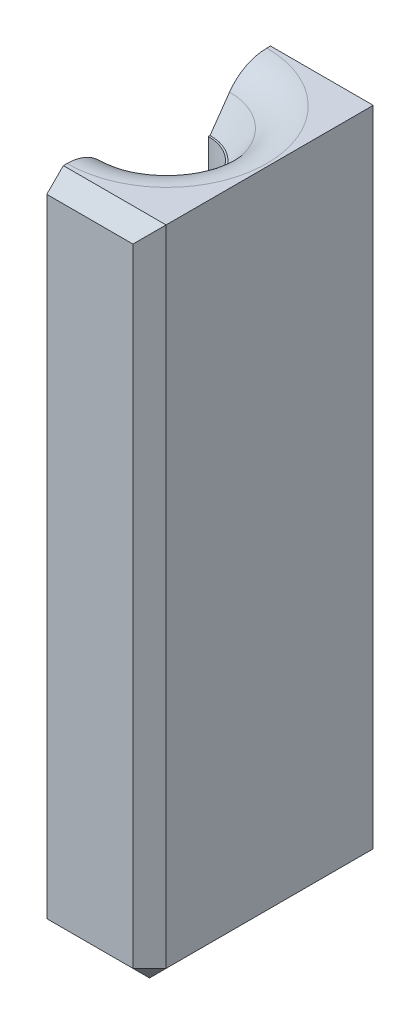
ISO-10303-21;
HEADER;
FILE_DESCRIPTION(('STEP AP214'),'2;1');
FILE_NAME('part.step','',(''),(''),'','','');
FILE_SCHEMA(('AUTOMOTIVE_DESIGN { 1 0 10303 214 1 1 1 1 }'));
ENDSEC;
DATA;
#1=APPLICATION_CONTEXT('core data for automotive mechanical design processes');
#2=APPLICATION_PROTOCOL_DEFINITION('international standard','automotive_design',2000,#1);
#3=PRODUCT_CONTEXT('',#1,'mechanical');
#4=PRODUCT('Part','Part','',(#3));
#5=PRODUCT_RELATED_PRODUCT_CATEGORY('part','',(#4));
#6=PRODUCT_DEFINITION_FORMATION('','',#4);
#7=PRODUCT_DEFINITION_CONTEXT('part definition',#1,'design');
#8=PRODUCT_DEFINITION('design','',#6,#7);
#9=PRODUCT_DEFINITION_SHAPE('','',#8);
#10=(LENGTH_UNIT() NAMED_UNIT(*) SI_UNIT(.MILLI.,.METRE.));
#11=(NAMED_UNIT(*) PLANE_ANGLE_UNIT() SI_UNIT($,.RADIAN.));
#12=(NAMED_UNIT(*) SI_UNIT($,.STERADIAN.) SOLID_ANGLE_UNIT());
#13=UNCERTAINTY_MEASURE_WITH_UNIT(LENGTH_MEASURE(1.E-05),#10,'distance_accuracy_value','');
#14=(GEOMETRIC_REPRESENTATION_CONTEXT(3) GLOBAL_UNCERTAINTY_ASSIGNED_CONTEXT((#13)) GLOBAL_UNIT_ASSIGNED_CONTEXT((#10,
#11,#12)) REPRESENTATION_CONTEXT('',''));
#15=CARTESIAN_POINT('',(0.,0.,0.));
#16=DIRECTION('',(0.,0.,1.));
#17=DIRECTION('',(1.,0.,0.));
#18=AXIS2_PLACEMENT_3D('',#15,#16,#17);
#19=CARTESIAN_POINT('',(30.,0.,0.));
#20=DIRECTION('',(-1.,0.,0.));
#21=DIRECTION('',(0.,0.,1.));
#22=AXIS2_PLACEMENT_3D('',#19,#20,#21);
#23=PLANE('',#22);
#24=CARTESIAN_POINT('',(30.,18.,-4.));
#25=DIRECTION('',(-1.,0.,0.));
#26=DIRECTION('',(0.,0.,1.));
#27=AXIS2_PLACEMENT_3D('',#24,#25,#26);
#28=CIRCLE('',#27,2.575);
#29=CARTESIAN_POINT('',(30.,18.,-1.425));
#30=VERTEX_POINT('',#29);
#31=EDGE_CURVE('E348',#30,#30,#28,.T.);
#32=ORIENTED_EDGE('',*,*,#31,.F.);
#33=EDGE_LOOP('',(#32));
#34=FACE_BOUND('',#33,.T.);
#35=CARTESIAN_POINT('',(30.,18.,-26.));
#36=DIRECTION('',(-1.,0.,0.));
#37=DIRECTION('',(0.,0.,1.));
#38=AXIS2_PLACEMENT_3D('',#35,#36,#37);
#39=CIRCLE('',#38,2.575);
#40=CARTESIAN_POINT('',(30.,18.,-23.425));
#41=VERTEX_POINT('',#40);
#42=EDGE_CURVE('E357',#41,#41,#39,.T.);
#43=ORIENTED_EDGE('',*,*,#42,.F.);
#44=EDGE_LOOP('',(#43));
#45=FACE_BOUND('',#44,.T.);
#46=CARTESIAN_POINT('',(30.,64.5,-26.));
#47=DIRECTION('',(-1.,0.,0.));
#48=DIRECTION('',(0.,0.,1.));
#49=AXIS2_PLACEMENT_3D('',#46,#47,#48);
#50=CIRCLE('',#49,2.575);
#51=CARTESIAN_POINT('',(30.,64.5,-23.425));
#52=VERTEX_POINT('',#51);
#53=EDGE_CURVE('E962',#52,#52,#50,.T.);
#54=ORIENTED_EDGE('',*,*,#53,.F.);
#55=EDGE_LOOP('',(#54));
#56=FACE_BOUND('',#55,.T.);
#57=CARTESIAN_POINT('',(30.,64.5,-4.));
#58=DIRECTION('',(-1.,0.,0.));
#59=DIRECTION('',(0.,0.,1.));
#60=AXIS2_PLACEMENT_3D('',#57,#58,#59);
#61=CIRCLE('',#60,2.575);
#62=CARTESIAN_POINT('',(30.,64.5,-1.42500000000001));
#63=VERTEX_POINT('',#62);
#64=EDGE_CURVE('E363',#63,#63,#61,.T.);
#65=ORIENTED_EDGE('',*,*,#64,.F.);
#66=EDGE_LOOP('',(#65));
#67=FACE_BOUND('',#66,.T.);
#68=DIRECTION('',(0.,1.,0.));
#69=VECTOR('',#68,1.);
#70=CARTESIAN_POINT('',(30.,0.,-0.5));
#71=LINE('',#70,#69);
#72=CARTESIAN_POINT('',(30.,6.28575422534895,-0.5));
#73=VERTEX_POINT('',#72);
#74=CARTESIAN_POINT('',(30.,82.,-0.5));
#75=VERTEX_POINT('',#74);
#76=EDGE_CURVE('E249',#73,#75,#71,.T.);
#77=ORIENTED_EDGE('',*,*,#76,.T.);
#78=DIRECTION('',(0.,0.707106781186546,-0.707106781186549));
#79=VECTOR('',#78,1.);
#80=CARTESIAN_POINT('',(30.,40.7500000000001,40.75));
#81=LINE('',#80,#79);
#82=CARTESIAN_POINT('',(30.,84.,-2.50000000000001));
#83=VERTEX_POINT('',#82);
#84=EDGE_CURVE('E305',#75,#83,#81,.T.);
#85=ORIENTED_EDGE('',*,*,#84,.T.);
#86=DIRECTION('',(0.,0.,-1.));
#87=VECTOR('',#86,1.);
#88=CARTESIAN_POINT('',(30.,84.,0.));
#89=LINE('',#88,#87);
#90=CARTESIAN_POINT('',(29.9999999999994,84.,-2.93688122196542));
#91=VERTEX_POINT('',#90);
#92=EDGE_CURVE('E409',#83,#91,#89,.T.);
#93=ORIENTED_EDGE('',*,*,#92,.T.);
#94=CARTESIAN_POINT('',(29.9999999999994,78.5,-2.93688122196542));
#95=DIRECTION('',(-1.,0.,0.));
#96=DIRECTION('',(0.,0.,1.));
#97=AXIS2_PLACEMENT_3D('',#94,#95,#96);
#98=CIRCLE('',#97,5.5);
#99=CARTESIAN_POINT('',(29.9999999999994,81.6546703999308,-7.44221746555486));
#100=VERTEX_POINT('',#99);
#101=EDGE_CURVE('E376',#100,#91,#98,.F.);
#102=ORIENTED_EDGE('',*,*,#101,.F.);
#103=DIRECTION('',(0.,0.819152044288991,0.573576436351047));
#104=VECTOR('',#103,1.);
#105=CARTESIAN_POINT('',(30.,70.8610383379726,-15.));
#106=LINE('',#105,#104);
#107=CARTESIAN_POINT('',(29.9999999999994,78.3,-9.79118296779536));
#108=VERTEX_POINT('',#107);
#109=EDGE_CURVE('E247',#100,#108,#106,.F.);
#110=ORIENTED_EDGE('',*,*,#109,.T.);
#111=DIRECTION('',(0.,0.,1.));
#112=VECTOR('',#111,1.);
#113=CARTESIAN_POINT('',(29.9999999999994,78.3,-15.));
#114=LINE('',#113,#112);
#115=CARTESIAN_POINT('',(29.9999999999994,78.3,-10.));
#116=VERTEX_POINT('',#115);
#117=EDGE_CURVE('E381',#116,#108,#114,.T.);
#118=ORIENTED_EDGE('',*,*,#117,.F.);
#119=DIRECTION('',(0.,1.,0.));
#120=VECTOR('',#119,1.);
#121=CARTESIAN_POINT('',(30.,0.,-10.));
#122=LINE('',#121,#120);
#123=CARTESIAN_POINT('',(30.,72.8279687630189,-10.));
#124=VERTEX_POINT('',#123);
#125=EDGE_CURVE('E397',#116,#124,#122,.F.);
#126=ORIENTED_EDGE('',*,*,#125,.T.);
#127=DIRECTION('',(0.,0.969140628666556,-0.246508502627785));
#128=VECTOR('',#127,1.);
#129=CARTESIAN_POINT('',(30.,92.4853156361592,-15.));
#130=LINE('',#129,#128);
#131=CARTESIAN_POINT('',(30.,58.9056790871227,-6.45875667613122));
#132=VERTEX_POINT('',#131);
#133=EDGE_CURVE('E440',#124,#132,#130,.F.);
#134=ORIENTED_EDGE('',*,*,#133,.T.);
#135=CARTESIAN_POINT('',(30.,58.1661535792394,-9.36617856213088));
#136=DIRECTION('',(-1.,0.,0.));
#137=DIRECTION('',(0.,0.,1.));
#138=AXIS2_PLACEMENT_3D('',#135,#136,#137);
#139=CIRCLE('',#138,3.);
#140=CARTESIAN_POINT('',(30.,56.4142970331814,-6.93081439182004));
#141=VERTEX_POINT('',#140);
#142=EDGE_CURVE('E443',#132,#141,#139,.F.);
#143=ORIENTED_EDGE('',*,*,#142,.T.);
#144=DIRECTION('',(0.,0.811788056770281,0.583952182019325));
#145=VECTOR('',#144,1.);
#146=CARTESIAN_POINT('',(30.,45.1968228867001,-15.));
#147=LINE('',#146,#145);
#148=CARTESIAN_POINT('',(30.,53.5848299933968,-8.96616516848405));
#149=VERTEX_POINT('',#148);
#150=EDGE_CURVE('E449',#141,#149,#147,.F.);
#151=ORIENTED_EDGE('',*,*,#150,.T.);
#152=CARTESIAN_POINT('',(30.,48.8259067213079,-2.3504914980669));
#153=DIRECTION('',(-1.,0.,0.));
#154=DIRECTION('',(0.,0.,1.));
#155=AXIS2_PLACEMENT_3D('',#152,#153,#154);
#156=CIRCLE('',#155,8.1495085019331);
#157=CARTESIAN_POINT('',(30.,51.6365131508767,-10.));
#158=VERTEX_POINT('',#157);
#159=EDGE_CURVE('E387',#158,#149,#156,.F.);
#160=ORIENTED_EDGE('',*,*,#159,.F.);
#161=DIRECTION('',(0.,1.,0.));
#162=VECTOR('',#161,1.);
#163=CARTESIAN_POINT('',(30.,0.,-10.));
#164=LINE('',#163,#162);
#165=CARTESIAN_POINT('',(30.,36.1674950601248,-10.));
#166=VERTEX_POINT('',#165);
#167=EDGE_CURVE('E431',#158,#166,#164,.F.);
#168=ORIENTED_EDGE('',*,*,#167,.T.);
#169=CARTESIAN_POINT('',(30.,38.9781014896936,-2.3504914980669));
#170=DIRECTION('',(-1.,0.,0.));
#171=DIRECTION('',(0.,0.,1.));
#172=AXIS2_PLACEMENT_3D('',#169,#170,#171);
#173=CIRCLE('',#172,8.1495085019331);
#174=CARTESIAN_POINT('',(30.,34.2191782176047,-8.96616516848405));
#175=VERTEX_POINT('',#174);
#176=EDGE_CURVE('E394',#175,#166,#173,.F.);
#177=ORIENTED_EDGE('',*,*,#176,.F.);
#178=DIRECTION('',(0.,0.811788056770281,-0.583952182019325));
#179=VECTOR('',#178,1.);
#180=CARTESIAN_POINT('',(30.,42.6071853243014,-15.));
#181=LINE('',#180,#179);
#182=CARTESIAN_POINT('',(30.,31.3897111778201,-6.93081439182004));
#183=VERTEX_POINT('',#182);
#184=EDGE_CURVE('E428',#175,#183,#181,.F.);
#185=ORIENTED_EDGE('',*,*,#184,.T.);
#186=CARTESIAN_POINT('',(30.,29.6378546317621,-9.36617856213088));
#187=DIRECTION('',(-1.,0.,0.));
#188=DIRECTION('',(0.,0.,1.));
#189=AXIS2_PLACEMENT_3D('',#186,#187,#188);
#190=CIRCLE('',#189,3.);
#191=CARTESIAN_POINT('',(30.,28.8983291238788,-6.45875667613122));
#192=VERTEX_POINT('',#191);
#193=EDGE_CURVE('E416',#183,#192,#190,.F.);
#194=ORIENTED_EDGE('',*,*,#193,.T.);
#195=DIRECTION('',(0.,0.969140628666556,0.246508502627785));
#196=VECTOR('',#195,1.);
#197=CARTESIAN_POINT('',(30.,-4.6813074251577,-15.));
#198=LINE('',#197,#196);
#199=CARTESIAN_POINT('',(30.,14.9760394479826,-10.));
#200=VERTEX_POINT('',#199);
#201=EDGE_CURVE('E419',#192,#200,#198,.F.);
#202=ORIENTED_EDGE('',*,*,#201,.T.);
#203=DIRECTION('',(0.,1.,0.));
#204=VECTOR('',#203,1.);
#205=CARTESIAN_POINT('',(30.,0.,-10.));
#206=LINE('',#205,#204);
#207=CARTESIAN_POINT('',(30.,11.,-10.));
#208=VERTEX_POINT('',#207);
#209=EDGE_CURVE('E240',#200,#208,#206,.F.);
#210=ORIENTED_EDGE('',*,*,#209,.T.);
#211=DIRECTION('',(0.,0.,-1.));
#212=VECTOR('',#211,1.);
#213=CARTESIAN_POINT('',(30.,11.,-15.));
#214=LINE('',#213,#212);
#215=CARTESIAN_POINT('',(30.,11.,-11.45));
#216=VERTEX_POINT('',#215);
#217=EDGE_CURVE('E455',#208,#216,#214,.T.);
#218=ORIENTED_EDGE('',*,*,#217,.T.);
#219=DIRECTION('',(0.,0.707106781186544,0.707106781186551));
#220=VECTOR('',#219,1.);
#221=CARTESIAN_POINT('',(30.,7.45000000000003,-15.));
#222=LINE('',#221,#220);
#223=CARTESIAN_POINT('',(30.,10.6,-11.85));
#224=VERTEX_POINT('',#223);
#225=EDGE_CURVE('E239',#224,#216,#222,.T.);
#226=ORIENTED_EDGE('',*,*,#225,.F.);
#227=DIRECTION('',(0.,-1.,0.));
#228=VECTOR('',#227,1.);
#229=CARTESIAN_POINT('',(30.,11.,-11.85));
#230=LINE('',#229,#228);
#231=CARTESIAN_POINT('',(30.,6.28575422534894,-11.85));
#232=VERTEX_POINT('',#231);
#233=EDGE_CURVE('E225',#224,#232,#230,.T.);
#234=ORIENTED_EDGE('',*,*,#233,.T.);
#235=DIRECTION('',(0.,0.,-1.));
#236=VECTOR('',#235,1.);
#237=CARTESIAN_POINT('',(30.,6.28575422534894,0.));
#238=LINE('',#237,#236);
#239=CARTESIAN_POINT('',(30.,6.28575422534894,-18.15));
#240=VERTEX_POINT('',#239);
#241=EDGE_CURVE('E237',#232,#240,#238,.T.);
#242=ORIENTED_EDGE('',*,*,#241,.T.);
#243=DIRECTION('',(0.,-1.,0.));
#244=VECTOR('',#243,1.);
#245=CARTESIAN_POINT('',(30.,11.,-18.15));
#246=LINE('',#245,#244);
#247=CARTESIAN_POINT('',(30.,10.6,-18.15));
#248=VERTEX_POINT('',#247);
#249=EDGE_CURVE('E228',#240,#248,#246,.F.);
#250=ORIENTED_EDGE('',*,*,#249,.T.);
#251=DIRECTION('',(0.,-0.707106781186544,0.707106781186551));
#252=VECTOR('',#251,1.);
#253=CARTESIAN_POINT('',(30.,7.45000000000003,-15.));
#254=LINE('',#253,#252);
#255=CARTESIAN_POINT('',(30.,11.,-18.55));
#256=VERTEX_POINT('',#255);
#257=EDGE_CURVE('E384',#256,#248,#254,.T.);
#258=ORIENTED_EDGE('',*,*,#257,.F.);
#259=CARTESIAN_POINT('',(30.,11.,-20.));
#260=VERTEX_POINT('',#259);
#261=EDGE_CURVE('E456',#256,#260,#214,.T.);
#262=ORIENTED_EDGE('',*,*,#261,.T.);
#263=DIRECTION('',(0.,1.,0.));
#264=VECTOR('',#263,1.);
#265=CARTESIAN_POINT('',(30.,0.,-20.));
#266=LINE('',#265,#264);
#267=CARTESIAN_POINT('',(30.,14.9760394479826,-20.));
#268=VERTEX_POINT('',#267);
#269=EDGE_CURVE('E406',#260,#268,#266,.T.);
#270=ORIENTED_EDGE('',*,*,#269,.T.);
#271=DIRECTION('',(0.,-0.969140628666556,0.246508502627785));
#272=VECTOR('',#271,1.);
#273=CARTESIAN_POINT('',(30.,-4.6813074251577,-15.));
#274=LINE('',#273,#272);
#275=CARTESIAN_POINT('',(30.,28.8983291238788,-23.5412433238688));
#276=VERTEX_POINT('',#275);
#277=EDGE_CURVE('E422',#268,#276,#274,.F.);
#278=ORIENTED_EDGE('',*,*,#277,.T.);
#279=CARTESIAN_POINT('',(30.,29.6378546317621,-20.6338214378691));
#280=DIRECTION('',(-1.,0.,0.));
#281=DIRECTION('',(0.,0.,1.));
#282=AXIS2_PLACEMENT_3D('',#279,#280,#281);
#283=CIRCLE('',#282,3.);
#284=CARTESIAN_POINT('',(30.,31.3897111778201,-23.06918560818));
#285=VERTEX_POINT('',#284);
#286=EDGE_CURVE('E413',#276,#285,#283,.F.);
#287=ORIENTED_EDGE('',*,*,#286,.T.);
#288=DIRECTION('',(0.,-0.811788056770281,-0.583952182019325));
#289=VECTOR('',#288,1.);
#290=CARTESIAN_POINT('',(30.,42.6071853243014,-15.));
#291=LINE('',#290,#289);
#292=CARTESIAN_POINT('',(30.,34.2191782176047,-21.0338348315159));
#293=VERTEX_POINT('',#292);
#294=EDGE_CURVE('E425',#285,#293,#291,.F.);
#295=ORIENTED_EDGE('',*,*,#294,.T.);
#296=CARTESIAN_POINT('',(30.,38.9781014896936,-27.6495085019331));
#297=DIRECTION('',(-1.,0.,0.));
#298=DIRECTION('',(0.,0.,1.));
#299=AXIS2_PLACEMENT_3D('',#296,#297,#298);
#300=CIRCLE('',#299,8.1495085019331);
#301=CARTESIAN_POINT('',(30.,36.1674950601248,-20.));
#302=VERTEX_POINT('',#301);
#303=EDGE_CURVE('E392',#302,#293,#300,.F.);
#304=ORIENTED_EDGE('',*,*,#303,.F.);
#305=DIRECTION('',(0.,1.,0.));
#306=VECTOR('',#305,1.);
#307=CARTESIAN_POINT('',(30.,0.,-20.));
#308=LINE('',#307,#306);
#309=CARTESIAN_POINT('',(30.,51.6365131508767,-20.));
#310=VERTEX_POINT('',#309);
#311=EDGE_CURVE('E434',#302,#310,#308,.T.);
#312=ORIENTED_EDGE('',*,*,#311,.T.);
#313=CARTESIAN_POINT('',(30.,48.8259067213079,-27.6495085019331));
#314=DIRECTION('',(-1.,0.,0.));
#315=DIRECTION('',(0.,0.,1.));
#316=AXIS2_PLACEMENT_3D('',#313,#314,#315);
#317=CIRCLE('',#316,8.1495085019331);
#318=CARTESIAN_POINT('',(30.,53.5848299933968,-21.0338348315159));
#319=VERTEX_POINT('',#318);
#320=EDGE_CURVE('E390',#319,#310,#317,.F.);
#321=ORIENTED_EDGE('',*,*,#320,.F.);
#322=DIRECTION('',(0.,-0.811788056770281,0.583952182019325));
#323=VECTOR('',#322,1.);
#324=CARTESIAN_POINT('',(30.,45.1968228867001,-15.));
#325=LINE('',#324,#323);
#326=CARTESIAN_POINT('',(30.,56.4142970331814,-23.06918560818));
#327=VERTEX_POINT('',#326);
#328=EDGE_CURVE('E452',#319,#327,#325,.F.);
#329=ORIENTED_EDGE('',*,*,#328,.T.);
#330=CARTESIAN_POINT('',(30.,58.1661535792394,-20.6338214378691));
#331=DIRECTION('',(-1.,0.,0.));
#332=DIRECTION('',(0.,0.,1.));
#333=AXIS2_PLACEMENT_3D('',#330,#331,#332);
#334=CIRCLE('',#333,3.);
#335=CARTESIAN_POINT('',(30.,58.9056790871227,-23.5412433238688));
#336=VERTEX_POINT('',#335);
#337=EDGE_CURVE('E446',#327,#336,#334,.F.);
#338=ORIENTED_EDGE('',*,*,#337,.T.);
#339=DIRECTION('',(0.,-0.969140628666556,-0.246508502627785));
#340=VECTOR('',#339,1.);
#341=CARTESIAN_POINT('',(30.,92.4853156361592,-15.));
#342=LINE('',#341,#340);
#343=CARTESIAN_POINT('',(30.,72.8279687630189,-20.));
#344=VERTEX_POINT('',#343);
#345=EDGE_CURVE('E437',#336,#344,#342,.F.);
#346=ORIENTED_EDGE('',*,*,#345,.T.);
#347=DIRECTION('',(0.,1.,0.));
#348=VECTOR('',#347,1.);
#349=CARTESIAN_POINT('',(30.,0.,-20.));
#350=LINE('',#349,#348);
#351=CARTESIAN_POINT('',(29.9999999999994,78.3,-20.));
#352=VERTEX_POINT('',#351);
#353=EDGE_CURVE('E400',#344,#352,#350,.T.);
#354=ORIENTED_EDGE('',*,*,#353,.T.);
#355=CARTESIAN_POINT('',(30.,78.3,-20.2088170322047));
#356=VERTEX_POINT('',#355);
#357=EDGE_CURVE('E382',#356,#352,#114,.T.);
#358=ORIENTED_EDGE('',*,*,#357,.F.);
#359=DIRECTION('',(0.,-0.819152044288991,0.573576436351047));
#360=VECTOR('',#359,1.);
#361=CARTESIAN_POINT('',(30.,70.8610383379726,-15.));
#362=LINE('',#361,#360);
#363=CARTESIAN_POINT('',(29.9999999999994,81.6546703999308,-22.5577825344452));
#364=VERTEX_POINT('',#363);
#365=EDGE_CURVE('E243',#356,#364,#362,.F.);
#366=ORIENTED_EDGE('',*,*,#365,.T.);
#367=CARTESIAN_POINT('',(29.9999999999994,78.5,-27.0631187780346));
#368=DIRECTION('',(-1.,0.,0.));
#369=DIRECTION('',(0.,0.,1.));
#370=AXIS2_PLACEMENT_3D('',#367,#368,#369);
#371=CIRCLE('',#370,5.5);
#372=CARTESIAN_POINT('',(29.9999999999994,84.,-27.0631187780346));
#373=VERTEX_POINT('',#372);
#374=EDGE_CURVE('E379',#373,#364,#371,.F.);
#375=ORIENTED_EDGE('',*,*,#374,.F.);
#376=CARTESIAN_POINT('',(30.,84.,-27.5));
#377=VERTEX_POINT('',#376);
#378=EDGE_CURVE('E410',#373,#377,#89,.T.);
#379=ORIENTED_EDGE('',*,*,#378,.T.);
#380=DIRECTION('',(0.,0.707106781186546,0.707106781186549));
#381=VECTOR('',#380,1.);
#382=CARTESIAN_POINT('',(30.,55.7500000000001,-55.75));
#383=LINE('',#382,#381);
#384=CARTESIAN_POINT('',(30.,82.,-29.5));
#385=VERTEX_POINT('',#384);
#386=EDGE_CURVE('E299',#377,#385,#383,.F.);
#387=ORIENTED_EDGE('',*,*,#386,.T.);
#388=DIRECTION('',(0.,1.,0.));
#389=VECTOR('',#388,1.);
#390=CARTESIAN_POINT('',(30.,0.,-29.5));
#391=LINE('',#390,#389);
#392=CARTESIAN_POINT('',(30.,6.28575422534894,-29.5));
#393=VERTEX_POINT('',#392);
#394=EDGE_CURVE('E244',#393,#385,#391,.T.);
#395=ORIENTED_EDGE('',*,*,#394,.F.);
#396=DIRECTION('',(0.,-0.707106781186546,0.707106781186549));
#397=VECTOR('',#396,1.);
#398=CARTESIAN_POINT('',(30.,-11.6071228873255,-11.6071228873255));
#399=LINE('',#398,#397);
#400=CARTESIAN_POINT('',(30.,4.28575422534894,-27.5));
#401=VERTEX_POINT('',#400);
#402=EDGE_CURVE('E301',#393,#401,#399,.T.);
#403=ORIENTED_EDGE('',*,*,#402,.T.);
#404=DIRECTION('',(0.,0.,-1.));
#405=VECTOR('',#404,1.);
#406=CARTESIAN_POINT('',(30.,4.28575422534894,0.));
#407=LINE('',#406,#405);
#408=CARTESIAN_POINT('',(30.,4.28575422534894,-2.5));
#409=VERTEX_POINT('',#408);
#410=EDGE_CURVE('E257',#409,#401,#407,.T.);
#411=ORIENTED_EDGE('',*,*,#410,.F.);
#412=DIRECTION('',(0.,-0.707106781186549,-0.707106781186546));
#413=VECTOR('',#412,1.);
#414=CARTESIAN_POINT('',(30.,3.39287711267446,-3.39287711267447));
#415=LINE('',#414,#413);
#416=EDGE_CURVE('E303',#409,#73,#415,.F.);
#417=ORIENTED_EDGE('',*,*,#416,.T.);
#418=EDGE_LOOP('',(#77,#85,#93,#102,#110,#118,#126,#134,#143,#151,#160,#168,#177,#185,#194,#202,
#210,#218,#226,#234,#242,#250,#258,#262,#270,#278,#287,#295,#304,#312,#321,#329,#338,#346,#354,
#358,#366,#375,#379,#387,#395,#403,#411,#417));
#419=FACE_BOUND('',#418,.T.);
#420=ADVANCED_FACE('F41',(#34,#45,#56,#67,#419),#23,.T.);
#421=CARTESIAN_POINT('',(15.,4.28575422534894,0.));
#422=DIRECTION('',(0.,-1.,0.));
#423=DIRECTION('',(0.,0.,-1.));
#424=AXIS2_PLACEMENT_3D('',#421,#422,#423);
#425=PLANE('',#424);
#426=DIRECTION('',(0.,0.,1.));
#427=VECTOR('',#426,1.);
#428=CARTESIAN_POINT('',(40.4,4.28575422534894,-0.5));
#429=LINE('',#428,#427);
#430=CARTESIAN_POINT('',(40.4,4.28575422534894,-27.5));
#431=VERTEX_POINT('',#430);
#432=CARTESIAN_POINT('',(40.4,4.28575422534894,-2.5));
#433=VERTEX_POINT('',#432);
#434=EDGE_CURVE('E319',#431,#433,#429,.T.);
#435=ORIENTED_EDGE('',*,*,#434,.T.);
#436=DIRECTION('',(-1.,0.,0.));
#437=VECTOR('',#436,1.);
#438=CARTESIAN_POINT('',(15.,4.28575422534894,-2.5));
#439=LINE('',#438,#437);
#440=EDGE_CURVE('E321',#433,#409,#439,.T.);
#441=ORIENTED_EDGE('',*,*,#440,.T.);
#442=ORIENTED_EDGE('',*,*,#410,.T.);
#443=DIRECTION('',(1.,0.,0.));
#444=VECTOR('',#443,1.);
#445=CARTESIAN_POINT('',(42.4,4.28575422534894,-27.5));
#446=LINE('',#445,#444);
#447=EDGE_CURVE('E317',#401,#431,#446,.T.);
#448=ORIENTED_EDGE('',*,*,#447,.T.);
#449=EDGE_LOOP('',(#435,#441,#442,#448));
#450=FACE_BOUND('',#449,.T.);
#451=ADVANCED_FACE('F536',(#450),#425,.T.);
#452=CARTESIAN_POINT('',(30.,0.,-15.));
#453=DIRECTION('',(0.,1.,0.));
#454=DIRECTION('',(0.,0.,1.));
#455=AXIS2_PLACEMENT_3D('',#452,#453,#454);
#456=CYLINDRICAL_SURFACE('',#455,5.);
#457=ORIENTED_EDGE('',*,*,#209,.F.);
#458=CARTESIAN_POINT('',(30.,14.9760394479826,-15.));
#459=DIRECTION('',(0.,1.,0.));
#460=DIRECTION('',(0.,0.,1.));
#461=AXIS2_PLACEMENT_3D('',#458,#459,#460);
#462=CIRCLE('',#461,5.);
#463=EDGE_CURVE('E274',#200,#268,#462,.T.);
#464=ORIENTED_EDGE('',*,*,#463,.T.);
#465=ORIENTED_EDGE('',*,*,#269,.F.);
#466=CARTESIAN_POINT('',(30.,11.,-15.));
#467=DIRECTION('',(0.,-1.,0.));
#468=DIRECTION('',(0.,0.,-1.));
#469=AXIS2_PLACEMENT_3D('',#466,#467,#468);
#470=CIRCLE('',#469,5.);
#471=EDGE_CURVE('E265',#208,#260,#470,.F.);
#472=ORIENTED_EDGE('',*,*,#471,.F.);
#473=EDGE_LOOP('',(#457,#464,#465,#472));
#474=FACE_BOUND('',#473,.T.);
#475=ADVANCED_FACE('F516',(#474),#456,.F.);
#476=CARTESIAN_POINT('',(30.,11.,-15.));
#477=DIRECTION('',(0.,-1.,0.));
#478=DIRECTION('',(0.,0.,-1.));
#479=AXIS2_PLACEMENT_3D('',#476,#477,#478);
#480=PLANE('',#479);
#481=ORIENTED_EDGE('',*,*,#217,.F.);
#482=ORIENTED_EDGE('',*,*,#471,.T.);
#483=ORIENTED_EDGE('',*,*,#261,.F.);
#484=CARTESIAN_POINT('',(30.,11.,-15.));
#485=DIRECTION('',(0.,-1.,0.));
#486=DIRECTION('',(0.,0.,-1.));
#487=AXIS2_PLACEMENT_3D('',#484,#485,#486);
#488=CIRCLE('',#487,3.55000000000001);
#489=EDGE_CURVE('E260',#256,#216,#488,.T.);
#490=ORIENTED_EDGE('',*,*,#489,.T.);
#491=EDGE_LOOP('',(#481,#482,#483,#490));
#492=FACE_BOUND('',#491,.T.);
#493=ADVANCED_FACE('F519',(#492),#480,.F.);
#494=CARTESIAN_POINT('',(30.,11.,-15.));
#495=DIRECTION('',(0.,-1.,0.));
#496=DIRECTION('',(0.,0.,-1.));
#497=AXIS2_PLACEMENT_3D('',#494,#495,#496);
#498=CYLINDRICAL_SURFACE('',#497,3.15);
#499=ORIENTED_EDGE('',*,*,#249,.F.);
#500=CARTESIAN_POINT('',(30.,6.28575422534894,-15.));
#501=DIRECTION('',(0.,1.,0.));
#502=DIRECTION('',(0.,0.,1.));
#503=AXIS2_PLACEMENT_3D('',#500,#501,#502);
#504=CIRCLE('',#503,3.15);
#505=EDGE_CURVE('E221',#240,#232,#504,.F.);
#506=ORIENTED_EDGE('',*,*,#505,.T.);
#507=ORIENTED_EDGE('',*,*,#233,.F.);
#508=CARTESIAN_POINT('',(30.,10.6,-15.));
#509=DIRECTION('',(0.,-1.,0.));
#510=DIRECTION('',(0.,0.,-1.));
#511=AXIS2_PLACEMENT_3D('',#508,#509,#510);
#512=CIRCLE('',#511,3.15);
#513=EDGE_CURVE('E263',#224,#248,#512,.F.);
#514=ORIENTED_EDGE('',*,*,#513,.T.);
#515=EDGE_LOOP('',(#499,#506,#507,#514));
#516=FACE_BOUND('',#515,.T.);
#517=ADVANCED_FACE('F223',(#516),#498,.F.);
#518=CARTESIAN_POINT('',(15.,6.28575422534894,0.));
#519=DIRECTION('',(0.,-1.,0.));
#520=DIRECTION('',(0.,0.,-1.));
#521=AXIS2_PLACEMENT_3D('',#518,#519,#520);
#522=PLANE('',#521);
#523=ORIENTED_EDGE('',*,*,#241,.F.);
#524=ORIENTED_EDGE('',*,*,#505,.F.);
#525=EDGE_LOOP('',(#523,#524));
#526=FACE_BOUND('',#525,.T.);
#527=ADVANCED_FACE('F242',(#526),#522,.F.);
#528=CARTESIAN_POINT('',(30.,11.,-15.));
#529=DIRECTION('',(0.,1.,0.));
#530=DIRECTION('',(0.,0.,1.));
#531=AXIS2_PLACEMENT_3D('',#528,#529,#530);
#532=CONICAL_SURFACE('',#531,3.55000000000001,0.785398163397454);
#533=ORIENTED_EDGE('',*,*,#513,.F.);
#534=ORIENTED_EDGE('',*,*,#225,.T.);
#535=ORIENTED_EDGE('',*,*,#489,.F.);
#536=ORIENTED_EDGE('',*,*,#257,.T.);
#537=EDGE_LOOP('',(#533,#534,#535,#536));
#538=FACE_BOUND('',#537,.T.);
#539=ADVANCED_FACE('F523',(#538),#532,.F.);
#540=CARTESIAN_POINT('',(30.,29.6378546317621,-15.));
#541=DIRECTION('',(0.,-1.,0.));
#542=DIRECTION('',(0.,0.,1.));
#543=AXIS2_PLACEMENT_3D('',#540,#541,#542);
#544=TOROIDAL_SURFACE('',#543,5.63382143786911,3.);
#545=ORIENTED_EDGE('',*,*,#286,.F.);
#546=CARTESIAN_POINT('',(30.,28.8983291238788,-15.));
#547=DIRECTION('',(0.,1.,0.));
#548=DIRECTION('',(0.,0.,1.));
#549=AXIS2_PLACEMENT_3D('',#546,#547,#548);
#550=CIRCLE('',#549,8.54124332386878);
#551=EDGE_CURVE('E285',#192,#276,#550,.T.);
#552=ORIENTED_EDGE('',*,*,#551,.F.);
#553=ORIENTED_EDGE('',*,*,#193,.F.);
#554=CARTESIAN_POINT('',(30.,31.3897111778201,-15.));
#555=DIRECTION('',(0.,-1.,0.));
#556=DIRECTION('',(0.,0.,-1.));
#557=AXIS2_PLACEMENT_3D('',#554,#555,#556);
#558=CIRCLE('',#557,8.06918560817996);
#559=EDGE_CURVE('E287',#285,#183,#558,.T.);
#560=ORIENTED_EDGE('',*,*,#559,.F.);
#561=EDGE_LOOP('',(#545,#552,#553,#560));
#562=FACE_BOUND('',#561,.T.);
#563=ADVANCED_FACE('F508',(#562),#544,.F.);
#564=CARTESIAN_POINT('',(30.,34.4020041055008,-15.));
#565=DIRECTION('',(0.,-1.,0.));
#566=DIRECTION('',(0.,0.,1.));
#567=AXIS2_PLACEMENT_3D('',#564,#565,#566);
#568=CONICAL_SURFACE('',#567,5.90232073091279,0.623588704481849);
#569=ORIENTED_EDGE('',*,*,#294,.F.);
#570=ORIENTED_EDGE('',*,*,#559,.T.);
#571=ORIENTED_EDGE('',*,*,#184,.F.);
#572=CARTESIAN_POINT('',(30.,34.2191782176047,-15.));
#573=DIRECTION('',(0.,-1.,0.));
#574=DIRECTION('',(0.,0.,-1.));
#575=AXIS2_PLACEMENT_3D('',#572,#573,#574);
#576=CIRCLE('',#575,6.03383483151595);
#577=EDGE_CURVE('E282',#175,#293,#576,.F.);
#578=ORIENTED_EDGE('',*,*,#577,.T.);
#579=EDGE_LOOP('',(#569,#570,#571,#578));
#580=FACE_BOUND('',#579,.T.);
#581=ADVANCED_FACE('F504',(#580),#568,.F.);
#582=CARTESIAN_POINT('',(30.,38.9781014896936,-15.));
#583=DIRECTION('',(0.,1.,0.));
#584=DIRECTION('',(0.,0.,-1.));
#585=AXIS2_PLACEMENT_3D('',#582,#583,#584);
#586=TOROIDAL_SURFACE('',#585,12.6495085019331,8.1495085019331);
#587=ORIENTED_EDGE('',*,*,#577,.F.);
#588=ORIENTED_EDGE('',*,*,#176,.T.);
#589=CARTESIAN_POINT('',(30.,36.1674950601248,-15.));
#590=DIRECTION('',(0.,1.,0.));
#591=DIRECTION('',(0.,0.,1.));
#592=AXIS2_PLACEMENT_3D('',#589,#590,#591);
#593=CIRCLE('',#592,5.);
#594=EDGE_CURVE('E272',#166,#302,#593,.T.);
#595=ORIENTED_EDGE('',*,*,#594,.T.);
#596=ORIENTED_EDGE('',*,*,#303,.T.);
#597=EDGE_LOOP('',(#587,#588,#595,#596));
#598=FACE_BOUND('',#597,.T.);
#599=ADVANCED_FACE('F500',(#598),#586,.T.);
#600=ORIENTED_EDGE('',*,*,#167,.F.);
#601=CARTESIAN_POINT('',(30.,51.6365131508767,-15.));
#602=DIRECTION('',(0.,-1.,0.));
#603=DIRECTION('',(0.,0.,-1.));
#604=AXIS2_PLACEMENT_3D('',#601,#602,#603);
#605=CIRCLE('',#604,5.);
#606=EDGE_CURVE('E267',#310,#158,#605,.T.);
#607=ORIENTED_EDGE('',*,*,#606,.F.);
#608=ORIENTED_EDGE('',*,*,#311,.F.);
#609=ORIENTED_EDGE('',*,*,#594,.F.);
#610=EDGE_LOOP('',(#600,#607,#608,#609));
#611=FACE_BOUND('',#610,.T.);
#612=ADVANCED_FACE('F495',(#611),#456,.F.);
#613=ORIENTED_EDGE('',*,*,#125,.F.);
#614=CARTESIAN_POINT('',(30.,78.3,-15.));
#615=DIRECTION('',(0.,1.,0.));
#616=DIRECTION('',(0.,0.,1.));
#617=AXIS2_PLACEMENT_3D('',#614,#615,#616);
#618=CIRCLE('',#617,5.);
#619=EDGE_CURVE('E289',#352,#116,#618,.F.);
#620=ORIENTED_EDGE('',*,*,#619,.F.);
#621=ORIENTED_EDGE('',*,*,#353,.F.);
#622=CARTESIAN_POINT('',(30.,72.8279687630189,-15.));
#623=DIRECTION('',(0.,-1.,0.));
#624=DIRECTION('',(0.,0.,-1.));
#625=AXIS2_PLACEMENT_3D('',#622,#623,#624);
#626=CIRCLE('',#625,5.);
#627=EDGE_CURVE('E270',#344,#124,#626,.T.);
#628=ORIENTED_EDGE('',*,*,#627,.T.);
#629=EDGE_LOOP('',(#613,#620,#621,#628));
#630=FACE_BOUND('',#629,.T.);
#631=ADVANCED_FACE('F476',(#630),#456,.F.);
#632=CARTESIAN_POINT('',(29.9999999999994,78.3,-15.));
#633=DIRECTION('',(0.,1.,0.));
#634=DIRECTION('',(0.,0.,1.));
#635=AXIS2_PLACEMENT_3D('',#632,#633,#634);
#636=PLANE('',#635);
#637=CARTESIAN_POINT('',(29.9999999999994,78.3,-15.));
#638=DIRECTION('',(0.,1.,0.));
#639=DIRECTION('',(0.,0.,1.));
#640=AXIS2_PLACEMENT_3D('',#637,#638,#639);
#641=CIRCLE('',#640,5.20881703220465);
#642=EDGE_CURVE('E233',#108,#356,#641,.T.);
#643=ORIENTED_EDGE('',*,*,#642,.T.);
#644=ORIENTED_EDGE('',*,*,#357,.T.);
#645=ORIENTED_EDGE('',*,*,#619,.T.);
#646=ORIENTED_EDGE('',*,*,#117,.T.);
#647=EDGE_LOOP('',(#643,#644,#645,#646));
#648=FACE_BOUND('',#647,.T.);
#649=ADVANCED_FACE('F474',(#648),#636,.T.);
#650=CARTESIAN_POINT('',(29.9999999999994,84.,-15.));
#651=DIRECTION('',(0.,1.,0.));
#652=DIRECTION('',(0.,0.,1.));
#653=AXIS2_PLACEMENT_3D('',#650,#651,#652);
#654=CONICAL_SURFACE('',#653,9.2,0.610865238198017);
#655=ORIENTED_EDGE('',*,*,#109,.F.);
#656=CARTESIAN_POINT('',(29.9999999999994,81.6546703999308,-15.));
#657=DIRECTION('',(0.,-1.,0.));
#658=DIRECTION('',(0.,0.,-1.));
#659=AXIS2_PLACEMENT_3D('',#656,#657,#658);
#660=CIRCLE('',#659,7.55778253444515);
#661=EDGE_CURVE('E256',#100,#364,#660,.F.);
#662=ORIENTED_EDGE('',*,*,#661,.T.);
#663=ORIENTED_EDGE('',*,*,#365,.F.);
#664=ORIENTED_EDGE('',*,*,#642,.F.);
#665=EDGE_LOOP('',(#655,#662,#663,#664));
#666=FACE_BOUND('',#665,.T.);
#667=ADVANCED_FACE('F464',(#666),#654,.F.);
#668=CARTESIAN_POINT('',(15.,84.,0.));
#669=DIRECTION('',(0.,-1.,0.));
#670=DIRECTION('',(0.,0.,-1.));
#671=AXIS2_PLACEMENT_3D('',#668,#669,#670);
#672=PLANE('',#671);
#673=ORIENTED_EDGE('',*,*,#92,.F.);
#674=DIRECTION('',(1.,0.,0.));
#675=VECTOR('',#674,1.);
#676=CARTESIAN_POINT('',(42.4,84.,-2.50000000000001));
#677=LINE('',#676,#675);
#678=CARTESIAN_POINT('',(42.4,84.,-2.5));
#679=VERTEX_POINT('',#678);
#680=EDGE_CURVE('E309',#83,#679,#677,.T.);
#681=ORIENTED_EDGE('',*,*,#680,.T.);
#682=DIRECTION('',(0.,0.,1.));
#683=VECTOR('',#682,1.);
#684=CARTESIAN_POINT('',(42.4,84.,0.));
#685=LINE('',#684,#683);
#686=CARTESIAN_POINT('',(42.4,84.,-27.5));
#687=VERTEX_POINT('',#686);
#688=EDGE_CURVE('E370',#687,#679,#685,.T.);
#689=ORIENTED_EDGE('',*,*,#688,.F.);
#690=DIRECTION('',(-1.,0.,0.));
#691=VECTOR('',#690,1.);
#692=CARTESIAN_POINT('',(15.,84.,-27.5));
#693=LINE('',#692,#691);
#694=EDGE_CURVE('E307',#687,#377,#693,.T.);
#695=ORIENTED_EDGE('',*,*,#694,.T.);
#696=ORIENTED_EDGE('',*,*,#378,.F.);
#697=CARTESIAN_POINT('',(29.9999999999994,84.,-15.));
#698=DIRECTION('',(0.,-1.,0.));
#699=DIRECTION('',(0.,0.,-1.));
#700=AXIS2_PLACEMENT_3D('',#697,#698,#699);
#701=CIRCLE('',#700,12.0631187780346);
#702=EDGE_CURVE('E253',#373,#91,#701,.T.);
#703=ORIENTED_EDGE('',*,*,#702,.T.);
#704=EDGE_LOOP('',(#673,#681,#689,#695,#696,#703));
#705=FACE_BOUND('',#704,.T.);
#706=ADVANCED_FACE('F553',(#705),#672,.F.);
#707=CARTESIAN_POINT('',(29.9999999999994,78.5,-15.));
#708=DIRECTION('',(0.,-1.,0.));
#709=DIRECTION('',(0.,0.,-1.));
#710=AXIS2_PLACEMENT_3D('',#707,#708,#709);
#711=TOROIDAL_SURFACE('',#710,12.0631187780346,5.5);
#712=ORIENTED_EDGE('',*,*,#702,.F.);
#713=ORIENTED_EDGE('',*,*,#374,.T.);
#714=ORIENTED_EDGE('',*,*,#661,.F.);
#715=ORIENTED_EDGE('',*,*,#101,.T.);
#716=EDGE_LOOP('',(#712,#713,#714,#715));
#717=FACE_BOUND('',#716,.T.);
#718=ADVANCED_FACE('F468',(#717),#711,.T.);
#719=CARTESIAN_POINT('',(30.,53.4020041055008,-15.));
#720=DIRECTION('',(0.,-1.,0.));
#721=DIRECTION('',(0.,0.,-1.));
#722=AXIS2_PLACEMENT_3D('',#719,#720,#721);
#723=CONICAL_SURFACE('',#722,9.94114612284268,0.249075921515313);
#724=ORIENTED_EDGE('',*,*,#345,.F.);
#725=CARTESIAN_POINT('',(30.,58.9056790871227,-15.));
#726=DIRECTION('',(0.,1.,0.));
#727=DIRECTION('',(0.,0.,1.));
#728=AXIS2_PLACEMENT_3D('',#725,#726,#727);
#729=CIRCLE('',#728,8.54124332386878);
#730=EDGE_CURVE('E278',#132,#336,#729,.T.);
#731=ORIENTED_EDGE('',*,*,#730,.F.);
#732=ORIENTED_EDGE('',*,*,#133,.F.);
#733=ORIENTED_EDGE('',*,*,#627,.F.);
#734=EDGE_LOOP('',(#724,#731,#732,#733));
#735=FACE_BOUND('',#734,.T.);
#736=ADVANCED_FACE('F481',(#735),#723,.F.);
#737=CARTESIAN_POINT('',(30.,48.8259067213079,-15.));
#738=DIRECTION('',(0.,-1.,0.));
#739=DIRECTION('',(0.,0.,-1.));
#740=AXIS2_PLACEMENT_3D('',#737,#738,#739);
#741=TOROIDAL_SURFACE('',#740,12.6495085019331,8.1495085019331);
#742=CARTESIAN_POINT('',(30.,53.5848299933968,-15.));
#743=DIRECTION('',(0.,-1.,0.));
#744=DIRECTION('',(0.,0.,-1.));
#745=AXIS2_PLACEMENT_3D('',#742,#743,#744);
#746=CIRCLE('',#745,6.03383483151595);
#747=EDGE_CURVE('E276',#149,#319,#746,.F.);
#748=ORIENTED_EDGE('',*,*,#747,.T.);
#749=ORIENTED_EDGE('',*,*,#320,.T.);
#750=ORIENTED_EDGE('',*,*,#606,.T.);
#751=ORIENTED_EDGE('',*,*,#159,.T.);
#752=EDGE_LOOP('',(#748,#749,#750,#751));
#753=FACE_BOUND('',#752,.T.);
#754=ADVANCED_FACE('F491',(#753),#741,.T.);
#755=CARTESIAN_POINT('',(30.,58.1661535792394,-15.));
#756=DIRECTION('',(0.,1.,0.));
#757=DIRECTION('',(0.,0.,1.));
#758=AXIS2_PLACEMENT_3D('',#755,#756,#757);
#759=TOROIDAL_SURFACE('',#758,5.63382143786911,3.);
#760=ORIENTED_EDGE('',*,*,#142,.F.);
#761=ORIENTED_EDGE('',*,*,#730,.T.);
#762=ORIENTED_EDGE('',*,*,#337,.F.);
#763=CARTESIAN_POINT('',(30.,56.4142970331814,-15.));
#764=DIRECTION('',(0.,-1.,0.));
#765=DIRECTION('',(0.,0.,-1.));
#766=AXIS2_PLACEMENT_3D('',#763,#764,#765);
#767=CIRCLE('',#766,8.06918560817996);
#768=EDGE_CURVE('E280',#327,#141,#767,.T.);
#769=ORIENTED_EDGE('',*,*,#768,.T.);
#770=EDGE_LOOP('',(#760,#761,#762,#769));
#771=FACE_BOUND('',#770,.T.);
#772=ADVANCED_FACE('F484',(#771),#759,.F.);
#773=CARTESIAN_POINT('',(30.,53.4020041055008,-15.));
#774=DIRECTION('',(0.,1.,0.));
#775=DIRECTION('',(0.,0.,1.));
#776=AXIS2_PLACEMENT_3D('',#773,#774,#775);
#777=CONICAL_SURFACE('',#776,5.90232073091279,0.623588704481849);
#778=ORIENTED_EDGE('',*,*,#150,.F.);
#779=ORIENTED_EDGE('',*,*,#768,.F.);
#780=ORIENTED_EDGE('',*,*,#328,.F.);
#781=ORIENTED_EDGE('',*,*,#747,.F.);
#782=EDGE_LOOP('',(#778,#779,#780,#781));
#783=FACE_BOUND('',#782,.T.);
#784=ADVANCED_FACE('F487',(#783),#777,.F.);
#785=CARTESIAN_POINT('',(30.,34.4020041055008,-15.));
#786=DIRECTION('',(0.,1.,0.));
#787=DIRECTION('',(0.,0.,-1.));
#788=AXIS2_PLACEMENT_3D('',#785,#786,#787);
#789=CONICAL_SURFACE('',#788,9.94114612284268,0.249075921515313);
#790=ORIENTED_EDGE('',*,*,#201,.F.);
#791=ORIENTED_EDGE('',*,*,#551,.T.);
#792=ORIENTED_EDGE('',*,*,#277,.F.);
#793=ORIENTED_EDGE('',*,*,#463,.F.);
#794=EDGE_LOOP('',(#790,#791,#792,#793));
#795=FACE_BOUND('',#794,.T.);
#796=ADVANCED_FACE('F511',(#795),#789,.F.);
#797=CARTESIAN_POINT('',(42.4,4.28575422534894,0.));
#798=DIRECTION('',(-1.,0.,0.));
#799=DIRECTION('',(0.,0.,1.));
#800=AXIS2_PLACEMENT_3D('',#797,#798,#799);
#801=PLANE('',#800);
#802=ORIENTED_EDGE('',*,*,#688,.T.);
#803=DIRECTION('',(0.,-1.,0.));
#804=VECTOR('',#803,1.);
#805=CARTESIAN_POINT('',(42.4,4.28575422534894,-2.5));
#806=LINE('',#805,#804);
#807=CARTESIAN_POINT('',(42.4,6.28575422534894,-2.5));
#808=VERTEX_POINT('',#807);
#809=EDGE_CURVE('E315',#679,#808,#806,.T.);
#810=ORIENTED_EDGE('',*,*,#809,.T.);
#811=DIRECTION('',(0.,0.,-1.));
#812=VECTOR('',#811,1.);
#813=CARTESIAN_POINT('',(42.4,6.28575422534894,-29.5));
#814=LINE('',#813,#812);
#815=CARTESIAN_POINT('',(42.4,6.28575422534894,-27.5));
#816=VERTEX_POINT('',#815);
#817=EDGE_CURVE('E313',#808,#816,#814,.T.);
#818=ORIENTED_EDGE('',*,*,#817,.T.);
#819=DIRECTION('',(0.,1.,0.));
#820=VECTOR('',#819,1.);
#821=CARTESIAN_POINT('',(42.4,4.28575422534894,-27.5));
#822=LINE('',#821,#820);
#823=EDGE_CURVE('E311',#816,#687,#822,.T.);
#824=ORIENTED_EDGE('',*,*,#823,.T.);
#825=EDGE_LOOP('',(#802,#810,#818,#824));
#826=FACE_BOUND('',#825,.T.);
#827=ADVANCED_FACE('F547',(#826),#801,.F.);
#828=CARTESIAN_POINT('',(15.,4.28575422534894,-29.5));
#829=DIRECTION('',(0.,0.,1.));
#830=DIRECTION('',(1.,0.,0.));
#831=AXIS2_PLACEMENT_3D('',#828,#829,#830);
#832=PLANE('',#831);
#833=DIRECTION('',(0.,-1.,0.));
#834=VECTOR('',#833,1.);
#835=CARTESIAN_POINT('',(40.4,4.28575422534894,-29.5));
#836=LINE('',#835,#834);
#837=CARTESIAN_POINT('',(40.4,82.,-29.5));
#838=VERTEX_POINT('',#837);
#839=CARTESIAN_POINT('',(40.4,6.28575422534894,-29.5));
#840=VERTEX_POINT('',#839);
#841=EDGE_CURVE('E51',#838,#840,#836,.T.);
#842=ORIENTED_EDGE('',*,*,#841,.T.);
#843=DIRECTION('',(-1.,0.,0.));
#844=VECTOR('',#843,1.);
#845=CARTESIAN_POINT('',(30.,6.28575422534894,-29.5));
#846=LINE('',#845,#844);
#847=EDGE_CURVE('E11',#840,#393,#846,.T.);
#848=ORIENTED_EDGE('',*,*,#847,.T.);
#849=ORIENTED_EDGE('',*,*,#394,.T.);
#850=DIRECTION('',(1.,0.,0.));
#851=VECTOR('',#850,1.);
#852=CARTESIAN_POINT('',(15.,82.,-29.5));
#853=LINE('',#852,#851);
#854=EDGE_CURVE('E62',#385,#838,#853,.T.);
#855=ORIENTED_EDGE('',*,*,#854,.T.);
#856=EDGE_LOOP('',(#842,#848,#849,#855));
#857=FACE_BOUND('',#856,.T.);
#858=ADVANCED_FACE('F649',(#857),#832,.F.);
#859=CARTESIAN_POINT('',(15.,4.28575422534894,-0.5));
#860=DIRECTION('',(0.,0.,1.));
#861=DIRECTION('',(1.,0.,0.));
#862=AXIS2_PLACEMENT_3D('',#859,#860,#861);
#863=PLANE('',#862);
#864=DIRECTION('',(0.,1.,0.));
#865=VECTOR('',#864,1.);
#866=CARTESIAN_POINT('',(40.4,84.,-0.5));
#867=LINE('',#866,#865);
#868=CARTESIAN_POINT('',(40.4,6.28575422534895,-0.5));
#869=VERTEX_POINT('',#868);
#870=CARTESIAN_POINT('',(40.4,82.,-0.5));
#871=VERTEX_POINT('',#870);
#872=EDGE_CURVE('E294',#869,#871,#867,.T.);
#873=ORIENTED_EDGE('',*,*,#872,.T.);
#874=DIRECTION('',(-1.,0.,0.));
#875=VECTOR('',#874,1.);
#876=CARTESIAN_POINT('',(29.9999999999994,82.,-0.5));
#877=LINE('',#876,#875);
#878=EDGE_CURVE('E296',#871,#75,#877,.T.);
#879=ORIENTED_EDGE('',*,*,#878,.T.);
#880=ORIENTED_EDGE('',*,*,#76,.F.);
#881=DIRECTION('',(1.,0.,0.));
#882=VECTOR('',#881,1.);
#883=CARTESIAN_POINT('',(15.,6.28575422534895,-0.5));
#884=LINE('',#883,#882);
#885=EDGE_CURVE('E232',#73,#869,#884,.T.);
#886=ORIENTED_EDGE('',*,*,#885,.T.);
#887=EDGE_LOOP('',(#873,#879,#880,#886));
#888=FACE_BOUND('',#887,.T.);
#889=ADVANCED_FACE('F657',(#888),#863,.T.);
#890=CARTESIAN_POINT('',(30.,64.5,-4.));
#891=DIRECTION('',(-1.,0.,0.));
#892=DIRECTION('',(0.,0.,1.));
#893=AXIS2_PLACEMENT_3D('',#890,#891,#892);
#894=CONICAL_SURFACE('',#893,2.575,0.349065850398867);
#895=CARTESIAN_POINT('',(33.4,64.5,-4.));
#896=DIRECTION('',(-1.,0.,0.));
#897=DIRECTION('',(0.,0.,1.));
#898=AXIS2_PLACEMENT_3D('',#895,#896,#897);
#899=CIRCLE('',#898,1.33750120349491);
#900=CARTESIAN_POINT('',(33.4,64.5,-2.6624987965051));
#901=VERTEX_POINT('',#900);
#902=EDGE_CURVE('E366',#901,#901,#899,.T.);
#903=ORIENTED_EDGE('',*,*,#902,.F.);
#904=EDGE_LOOP('',(#903));
#905=FACE_BOUND('',#904,.T.);
#906=ORIENTED_EDGE('',*,*,#64,.T.);
#907=EDGE_LOOP('',(#906));
#908=FACE_BOUND('',#907,.T.);
#909=ADVANCED_FACE('F665',(#905,#908),#894,.F.);
#910=CARTESIAN_POINT('',(33.4,64.5,-4.));
#911=DIRECTION('',(-1.,0.,0.));
#912=DIRECTION('',(0.,0.,1.));
#913=AXIS2_PLACEMENT_3D('',#910,#911,#912);
#914=PLANE('',#913);
#915=ORIENTED_EDGE('',*,*,#902,.T.);
#916=EDGE_LOOP('',(#915));
#917=FACE_BOUND('',#916,.T.);
#918=ADVANCED_FACE('F673',(#917),#914,.T.);
#919=CARTESIAN_POINT('',(30.,64.5,-26.));
#920=DIRECTION('',(-1.,0.,0.));
#921=DIRECTION('',(0.,0.,1.));
#922=AXIS2_PLACEMENT_3D('',#919,#920,#921);
#923=CONICAL_SURFACE('',#922,2.575,0.349065850398867);
#924=CARTESIAN_POINT('',(33.4,64.5,-26.));
#925=DIRECTION('',(-1.,0.,0.));
#926=DIRECTION('',(0.,0.,1.));
#927=AXIS2_PLACEMENT_3D('',#924,#925,#926);
#928=CIRCLE('',#927,1.3375012034949);
#929=CARTESIAN_POINT('',(33.4,64.5,-24.6624987965051));
#930=VERTEX_POINT('',#929);
#931=EDGE_CURVE('E367',#930,#930,#928,.T.);
#932=ORIENTED_EDGE('',*,*,#931,.F.);
#933=EDGE_LOOP('',(#932));
#934=FACE_BOUND('',#933,.T.);
#935=ORIENTED_EDGE('',*,*,#53,.T.);
#936=EDGE_LOOP('',(#935));
#937=FACE_BOUND('',#936,.T.);
#938=ADVANCED_FACE('F682',(#934,#937),#923,.F.);
#939=CARTESIAN_POINT('',(33.4,64.5,-26.));
#940=DIRECTION('',(-1.,0.,0.));
#941=DIRECTION('',(0.,0.,1.));
#942=AXIS2_PLACEMENT_3D('',#939,#940,#941);
#943=PLANE('',#942);
#944=ORIENTED_EDGE('',*,*,#931,.T.);
#945=EDGE_LOOP('',(#944));
#946=FACE_BOUND('',#945,.T.);
#947=ADVANCED_FACE('F691',(#946),#943,.T.);
#948=CARTESIAN_POINT('',(30.,18.,-26.));
#949=DIRECTION('',(-1.,0.,0.));
#950=DIRECTION('',(0.,0.,1.));
#951=AXIS2_PLACEMENT_3D('',#948,#949,#950);
#952=CONICAL_SURFACE('',#951,2.575,0.349065850398867);
#953=CARTESIAN_POINT('',(33.4,18.,-26.));
#954=DIRECTION('',(-1.,0.,0.));
#955=DIRECTION('',(0.,0.,1.));
#956=AXIS2_PLACEMENT_3D('',#953,#954,#955);
#957=CIRCLE('',#956,1.33750120349491);
#958=CARTESIAN_POINT('',(33.4,18.,-24.6624987965051));
#959=VERTEX_POINT('',#958);
#960=EDGE_CURVE('E360',#959,#959,#957,.T.);
#961=ORIENTED_EDGE('',*,*,#960,.F.);
#962=EDGE_LOOP('',(#961));
#963=FACE_BOUND('',#962,.T.);
#964=ORIENTED_EDGE('',*,*,#42,.T.);
#965=EDGE_LOOP('',(#964));
#966=FACE_BOUND('',#965,.T.);
#967=ADVANCED_FACE('F700',(#963,#966),#952,.F.);
#968=CARTESIAN_POINT('',(33.4,18.,-26.));
#969=DIRECTION('',(-1.,0.,0.));
#970=DIRECTION('',(0.,0.,1.));
#971=AXIS2_PLACEMENT_3D('',#968,#969,#970);
#972=PLANE('',#971);
#973=ORIENTED_EDGE('',*,*,#960,.T.);
#974=EDGE_LOOP('',(#973));
#975=FACE_BOUND('',#974,.T.);
#976=ADVANCED_FACE('F709',(#975),#972,.T.);
#977=CARTESIAN_POINT('',(30.,18.,-4.));
#978=DIRECTION('',(-1.,0.,0.));
#979=DIRECTION('',(0.,0.,1.));
#980=AXIS2_PLACEMENT_3D('',#977,#978,#979);
#981=CONICAL_SURFACE('',#980,2.575,0.349065850398867);
#982=CARTESIAN_POINT('',(33.4,18.,-4.));
#983=DIRECTION('',(-1.,0.,0.));
#984=DIRECTION('',(0.,0.,1.));
#985=AXIS2_PLACEMENT_3D('',#982,#983,#984);
#986=CIRCLE('',#985,1.33750120349491);
#987=CARTESIAN_POINT('',(33.4,18.,-2.66249879650509));
#988=VERTEX_POINT('',#987);
#989=EDGE_CURVE('E352',#988,#988,#986,.T.);
#990=ORIENTED_EDGE('',*,*,#989,.F.);
#991=EDGE_LOOP('',(#990));
#992=FACE_BOUND('',#991,.T.);
#993=ORIENTED_EDGE('',*,*,#31,.T.);
#994=EDGE_LOOP('',(#993));
#995=FACE_BOUND('',#994,.T.);
#996=ADVANCED_FACE('F718',(#992,#995),#981,.F.);
#997=CARTESIAN_POINT('',(33.4,18.,-4.));
#998=DIRECTION('',(-1.,0.,0.));
#999=DIRECTION('',(0.,0.,1.));
#1000=AXIS2_PLACEMENT_3D('',#997,#998,#999);
#1001=PLANE('',#1000);
#1002=ORIENTED_EDGE('',*,*,#989,.T.);
#1003=EDGE_LOOP('',(#1002));
#1004=FACE_BOUND('',#1003,.T.);
#1005=ADVANCED_FACE('F727',(#1004),#1001,.T.);
#1006=CARTESIAN_POINT('',(15.,84.,-27.5));
#1007=DIRECTION('',(0.,-0.707106781186549,0.707106781186546));
#1008=DIRECTION('',(-1.,0.,0.));
#1009=AXIS2_PLACEMENT_3D('',#1006,#1007,#1008);
#1010=PLANE('',#1009);
#1011=ORIENTED_EDGE('',*,*,#386,.F.);
#1012=ORIENTED_EDGE('',*,*,#694,.F.);
#1013=DIRECTION('',(-0.577350269189625,-0.577350269189625,-0.577350269189627));
#1014=VECTOR('',#1013,1.);
#1015=CARTESIAN_POINT('',(33.2666666666667,74.8666666666667,-36.6333333333333));
#1016=LINE('',#1015,#1014);
#1017=EDGE_CURVE('E46',#838,#687,#1016,.F.);
#1018=ORIENTED_EDGE('',*,*,#1017,.F.);
#1019=ORIENTED_EDGE('',*,*,#854,.F.);
#1020=EDGE_LOOP('',(#1011,#1012,#1018,#1019));
#1021=FACE_BOUND('',#1020,.T.);
#1022=ADVANCED_FACE('F44',(#1021),#1010,.F.);
#1023=CARTESIAN_POINT('',(42.4,4.28575422534894,-27.5));
#1024=DIRECTION('',(-0.707106781186549,0.,0.707106781186546));
#1025=DIRECTION('',(0.,1.,0.));
#1026=AXIS2_PLACEMENT_3D('',#1023,#1024,#1025);
#1027=PLANE('',#1026);
#1028=ORIENTED_EDGE('',*,*,#1017,.T.);
#1029=ORIENTED_EDGE('',*,*,#823,.F.);
#1030=DIRECTION('',(-0.707106781186546,0.,-0.707106781186549));
#1031=VECTOR('',#1030,1.);
#1032=CARTESIAN_POINT('',(42.4,6.28575422534894,-27.5));
#1033=LINE('',#1032,#1031);
#1034=EDGE_CURVE('E342',#840,#816,#1033,.F.);
#1035=ORIENTED_EDGE('',*,*,#1034,.F.);
#1036=ORIENTED_EDGE('',*,*,#841,.F.);
#1037=EDGE_LOOP('',(#1028,#1029,#1035,#1036));
#1038=FACE_BOUND('',#1037,.T.);
#1039=ADVANCED_FACE('F744',(#1038),#1027,.F.);
#1040=CARTESIAN_POINT('',(15.,4.28575422534894,-27.5));
#1041=DIRECTION('',(0.,-0.707106781186549,-0.707106781186546));
#1042=DIRECTION('',(-1.,0.,0.));
#1043=AXIS2_PLACEMENT_3D('',#1040,#1041,#1042);
#1044=PLANE('',#1043);
#1045=ORIENTED_EDGE('',*,*,#402,.F.);
#1046=ORIENTED_EDGE('',*,*,#847,.F.);
#1047=DIRECTION('',(0.,0.707106781186546,-0.707106781186549));
#1048=VECTOR('',#1047,1.);
#1049=CARTESIAN_POINT('',(40.4,5.28575422534894,-28.5));
#1050=LINE('',#1049,#1048);
#1051=EDGE_CURVE('E340',#431,#840,#1050,.T.);
#1052=ORIENTED_EDGE('',*,*,#1051,.F.);
#1053=ORIENTED_EDGE('',*,*,#447,.F.);
#1054=EDGE_LOOP('',(#1045,#1046,#1052,#1053));
#1055=FACE_BOUND('',#1054,.T.);
#1056=ADVANCED_FACE('F752',(#1055),#1044,.T.);
#1057=CARTESIAN_POINT('',(42.4,6.28575422534894,-27.5));
#1058=DIRECTION('',(0.577350269189625,-0.577350269189628,-0.577350269189624));
#1059=DIRECTION('',(0.707106781186549,0.707106781186546,0.));
#1060=AXIS2_PLACEMENT_3D('',#1057,#1058,#1059);
#1061=PLANE('',#1060);
#1062=ORIENTED_EDGE('',*,*,#1051,.T.);
#1063=ORIENTED_EDGE('',*,*,#1034,.T.);
#1064=DIRECTION('',(-0.707106781186549,-0.707106781186546,0.));
#1065=VECTOR('',#1064,1.);
#1066=CARTESIAN_POINT('',(42.4,6.28575422534894,-27.5));
#1067=LINE('',#1066,#1065);
#1068=EDGE_CURVE('E337',#431,#816,#1067,.F.);
#1069=ORIENTED_EDGE('',*,*,#1068,.F.);
#1070=EDGE_LOOP('',(#1062,#1063,#1069));
#1071=FACE_BOUND('',#1070,.T.);
#1072=ADVANCED_FACE('F759',(#1071),#1061,.T.);
#1073=CARTESIAN_POINT('',(40.4,4.28575422534894,0.));
#1074=DIRECTION('',(0.707106781186546,-0.707106781186549,0.));
#1075=DIRECTION('',(0.,0.,-1.));
#1076=AXIS2_PLACEMENT_3D('',#1073,#1074,#1075);
#1077=PLANE('',#1076);
#1078=ORIENTED_EDGE('',*,*,#1068,.T.);
#1079=ORIENTED_EDGE('',*,*,#817,.F.);
#1080=DIRECTION('',(0.707106781186549,0.707106781186546,0.));
#1081=VECTOR('',#1080,1.);
#1082=CARTESIAN_POINT('',(42.4,6.28575422534894,-2.5));
#1083=LINE('',#1082,#1081);
#1084=EDGE_CURVE('E334',#433,#808,#1083,.T.);
#1085=ORIENTED_EDGE('',*,*,#1084,.F.);
#1086=ORIENTED_EDGE('',*,*,#434,.F.);
#1087=EDGE_LOOP('',(#1078,#1079,#1085,#1086));
#1088=FACE_BOUND('',#1087,.T.);
#1089=ADVANCED_FACE('F768',(#1088),#1077,.T.);
#1090=CARTESIAN_POINT('',(15.,6.28575422534895,-0.5));
#1091=DIRECTION('',(0.,0.707106781186546,-0.707106781186549));
#1092=DIRECTION('',(1.,0.,0.));
#1093=AXIS2_PLACEMENT_3D('',#1090,#1091,#1092);
#1094=PLANE('',#1093);
#1095=ORIENTED_EDGE('',*,*,#416,.F.);
#1096=ORIENTED_EDGE('',*,*,#440,.F.);
#1097=DIRECTION('',(0.,0.707106781186549,0.707106781186546));
#1098=VECTOR('',#1097,1.);
#1099=CARTESIAN_POINT('',(40.4,5.28575422534894,-1.5));
#1100=LINE('',#1099,#1098);
#1101=EDGE_CURVE('E331',#869,#433,#1100,.F.);
#1102=ORIENTED_EDGE('',*,*,#1101,.F.);
#1103=ORIENTED_EDGE('',*,*,#885,.F.);
#1104=EDGE_LOOP('',(#1095,#1096,#1102,#1103));
#1105=FACE_BOUND('',#1104,.T.);
#1106=ADVANCED_FACE('F776',(#1105),#1094,.F.);
#1107=CARTESIAN_POINT('',(42.4,6.28575422534894,-2.5));
#1108=DIRECTION('',(0.577350269189624,-0.577350269189626,0.577350269189628));
#1109=DIRECTION('',(0.,-0.707106781186549,-0.707106781186546));
#1110=AXIS2_PLACEMENT_3D('',#1107,#1108,#1109);
#1111=PLANE('',#1110);
#1112=ORIENTED_EDGE('',*,*,#1101,.T.);
#1113=ORIENTED_EDGE('',*,*,#1084,.T.);
#1114=DIRECTION('',(-0.707106781186549,0.,0.707106781186546));
#1115=VECTOR('',#1114,1.);
#1116=CARTESIAN_POINT('',(42.4,6.28575422534894,-2.5));
#1117=LINE('',#1116,#1115);
#1118=EDGE_CURVE('E328',#869,#808,#1117,.F.);
#1119=ORIENTED_EDGE('',*,*,#1118,.F.);
#1120=EDGE_LOOP('',(#1112,#1113,#1119));
#1121=FACE_BOUND('',#1120,.T.);
#1122=ADVANCED_FACE('F785',(#1121),#1111,.T.);
#1123=CARTESIAN_POINT('',(40.4,4.28575422534894,-0.5));
#1124=DIRECTION('',(0.707106781186546,0.,0.707106781186549));
#1125=DIRECTION('',(0.,-1.,0.));
#1126=AXIS2_PLACEMENT_3D('',#1123,#1124,#1125);
#1127=PLANE('',#1126);
#1128=ORIENTED_EDGE('',*,*,#1118,.T.);
#1129=ORIENTED_EDGE('',*,*,#809,.F.);
#1130=DIRECTION('',(-0.577350269189628,-0.577350269189624,0.577350269189626));
#1131=VECTOR('',#1130,1.);
#1132=CARTESIAN_POINT('',(14.4952514084496,56.0952514084498,25.4047485915503));
#1133=LINE('',#1132,#1131);
#1134=EDGE_CURVE('E325',#871,#679,#1133,.F.);
#1135=ORIENTED_EDGE('',*,*,#1134,.F.);
#1136=ORIENTED_EDGE('',*,*,#872,.F.);
#1137=EDGE_LOOP('',(#1128,#1129,#1135,#1136));
#1138=FACE_BOUND('',#1137,.T.);
#1139=ADVANCED_FACE('F794',(#1138),#1127,.T.);
#1140=CARTESIAN_POINT('',(15.,82.,-0.5));
#1141=DIRECTION('',(0.,0.707106781186549,0.707106781186546));
#1142=DIRECTION('',(1.,0.,0.));
#1143=AXIS2_PLACEMENT_3D('',#1140,#1141,#1142);
#1144=PLANE('',#1143);
#1145=ORIENTED_EDGE('',*,*,#1134,.T.);
#1146=ORIENTED_EDGE('',*,*,#680,.F.);
#1147=ORIENTED_EDGE('',*,*,#84,.F.);
#1148=ORIENTED_EDGE('',*,*,#878,.F.);
#1149=EDGE_LOOP('',(#1145,#1146,#1147,#1148));
#1150=FACE_BOUND('',#1149,.T.);
#1151=ADVANCED_FACE('F803',(#1150),#1144,.T.);
#1152=CLOSED_SHELL('',(#420,#451,#475,#493,#517,#527,#539,#563,#581,#599,#612,#631,#649,#667,
#706,#718,#736,#754,#772,#784,#796,#827,#858,#889,#909,#918,#938,#947,#967,#976,#996,#1005,
#1022,#1039,#1056,#1072,#1089,#1106,#1122,#1139,#1151));
#1153=MANIFOLD_SOLID_BREP('B2',#1152);
#1154=ADVANCED_BREP_SHAPE_REPRESENTATION('',(#18,#1153),#14);
#1155=SHAPE_DEFINITION_REPRESENTATION(#9,#1154);
ENDSEC;
END-ISO-10303-21;
